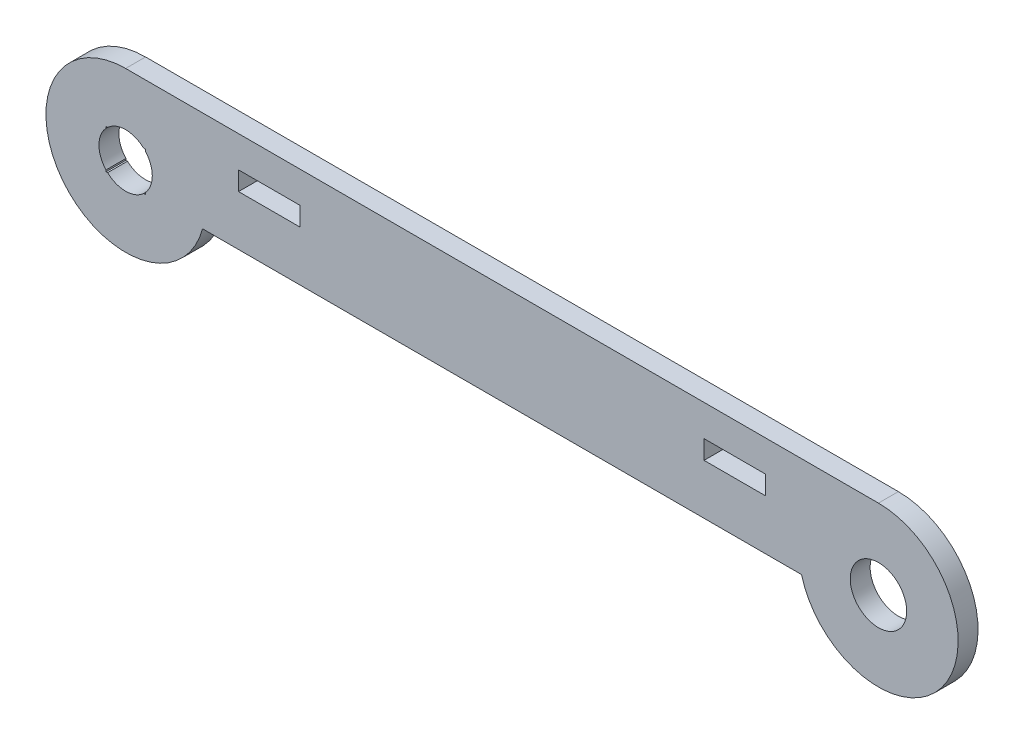
ISO-10303-21;
HEADER;
FILE_DESCRIPTION(('STEP AP214'),'2;1');
FILE_NAME('part.step','',(''),(''),'','','');
FILE_SCHEMA(('AUTOMOTIVE_DESIGN { 1 0 10303 214 1 1 1 1 }'));
ENDSEC;
DATA;
#1=APPLICATION_CONTEXT('core data for automotive mechanical design processes');
#2=APPLICATION_PROTOCOL_DEFINITION('international standard','automotive_design',2000,#1);
#3=PRODUCT_CONTEXT('',#1,'mechanical');
#4=PRODUCT('Part','Part','',(#3));
#5=PRODUCT_RELATED_PRODUCT_CATEGORY('part','',(#4));
#6=PRODUCT_DEFINITION_FORMATION('','',#4);
#7=PRODUCT_DEFINITION_CONTEXT('part definition',#1,'design');
#8=PRODUCT_DEFINITION('design','',#6,#7);
#9=PRODUCT_DEFINITION_SHAPE('','',#8);
#10=(LENGTH_UNIT() NAMED_UNIT(*) SI_UNIT(.MILLI.,.METRE.));
#11=(NAMED_UNIT(*) PLANE_ANGLE_UNIT() SI_UNIT($,.RADIAN.));
#12=(NAMED_UNIT(*) SI_UNIT($,.STERADIAN.) SOLID_ANGLE_UNIT());
#13=UNCERTAINTY_MEASURE_WITH_UNIT(LENGTH_MEASURE(1.E-05),#10,'distance_accuracy_value','');
#14=(GEOMETRIC_REPRESENTATION_CONTEXT(3) GLOBAL_UNCERTAINTY_ASSIGNED_CONTEXT((#13)) GLOBAL_UNIT_ASSIGNED_CONTEXT((#10,
#11,#12)) REPRESENTATION_CONTEXT('',''));
#15=CARTESIAN_POINT('',(0.,0.,0.));
#16=DIRECTION('',(0.,0.,1.));
#17=DIRECTION('',(1.,0.,0.));
#18=AXIS2_PLACEMENT_3D('',#15,#16,#17);
#19=CARTESIAN_POINT('',(1.565,0.,1.5875));
#20=DIRECTION('',(-1.,0.,0.));
#21=DIRECTION('',(0.,0.,1.));
#22=AXIS2_PLACEMENT_3D('',#19,#20,#21);
#23=PLANE('',#22);
#24=DIRECTION('',(0.,0.,1.));
#25=VECTOR('',#24,1.);
#26=CARTESIAN_POINT('',(1.565,-1.43749782608531,0.));
#27=LINE('',#26,#25);
#28=CARTESIAN_POINT('',(1.565,-1.43749782608531,0.));
#29=VERTEX_POINT('',#28);
#30=CARTESIAN_POINT('',(1.565,-1.43749782608531,1.5875));
#31=VERTEX_POINT('',#30);
#32=EDGE_CURVE('E285',#29,#31,#27,.T.);
#33=ORIENTED_EDGE('',*,*,#32,.F.);
#34=DIRECTION('',(0.,1.,0.));
#35=VECTOR('',#34,1.);
#36=CARTESIAN_POINT('',(1.565,0.,0.));
#37=LINE('',#36,#35);
#38=CARTESIAN_POINT('',(1.565,-1.565,0.));
#39=VERTEX_POINT('',#38);
#40=EDGE_CURVE('E321',#39,#29,#37,.T.);
#41=ORIENTED_EDGE('',*,*,#40,.F.);
#42=DIRECTION('',(0.,0.,-1.));
#43=VECTOR('',#42,1.);
#44=CARTESIAN_POINT('',(1.565,-1.565,1.5875));
#45=LINE('',#44,#43);
#46=CARTESIAN_POINT('',(1.565,-1.565,1.5875));
#47=VERTEX_POINT('',#46);
#48=EDGE_CURVE('E239',#47,#39,#45,.T.);
#49=ORIENTED_EDGE('',*,*,#48,.F.);
#50=DIRECTION('',(0.,1.,0.));
#51=VECTOR('',#50,1.);
#52=CARTESIAN_POINT('',(1.565,0.,1.5875));
#53=LINE('',#52,#51);
#54=EDGE_CURVE('E340',#47,#31,#53,.T.);
#55=ORIENTED_EDGE('',*,*,#54,.T.);
#56=EDGE_LOOP('',(#33,#41,#49,#55));
#57=FACE_BOUND('',#56,.T.);
#58=ADVANCED_FACE('F34',(#57),#23,.T.);
#59=CARTESIAN_POINT('',(0.,-1.565,1.5875));
#60=DIRECTION('',(0.,1.,0.));
#61=DIRECTION('',(0.,0.,1.));
#62=AXIS2_PLACEMENT_3D('',#59,#60,#61);
#63=PLANE('',#62);
#64=DIRECTION('',(0.,0.,1.));
#65=VECTOR('',#64,1.);
#66=CARTESIAN_POINT('',(-1.43749782608531,-1.565,0.));
#67=LINE('',#66,#65);
#68=CARTESIAN_POINT('',(-1.43749782608531,-1.565,0.));
#69=VERTEX_POINT('',#68);
#70=CARTESIAN_POINT('',(-1.43749782608531,-1.565,1.5875));
#71=VERTEX_POINT('',#70);
#72=EDGE_CURVE('E413',#69,#71,#67,.T.);
#73=ORIENTED_EDGE('',*,*,#72,.F.);
#74=DIRECTION('',(1.,0.,0.));
#75=VECTOR('',#74,1.);
#76=CARTESIAN_POINT('',(0.,-1.565,0.));
#77=LINE('',#76,#75);
#78=CARTESIAN_POINT('',(-1.565,-1.565,0.));
#79=VERTEX_POINT('',#78);
#80=EDGE_CURVE('E324',#79,#69,#77,.T.);
#81=ORIENTED_EDGE('',*,*,#80,.F.);
#82=DIRECTION('',(0.,0.,-1.));
#83=VECTOR('',#82,1.);
#84=CARTESIAN_POINT('',(-1.565,-1.565,1.5875));
#85=LINE('',#84,#83);
#86=CARTESIAN_POINT('',(-1.565,-1.565,1.5875));
#87=VERTEX_POINT('',#86);
#88=EDGE_CURVE('E237',#87,#79,#85,.T.);
#89=ORIENTED_EDGE('',*,*,#88,.F.);
#90=DIRECTION('',(1.,0.,0.));
#91=VECTOR('',#90,1.);
#92=CARTESIAN_POINT('',(0.,-1.565,1.5875));
#93=LINE('',#92,#91);
#94=EDGE_CURVE('E369',#87,#71,#93,.T.);
#95=ORIENTED_EDGE('',*,*,#94,.T.);
#96=EDGE_LOOP('',(#73,#81,#89,#95));
#97=FACE_BOUND('',#96,.T.);
#98=ADVANCED_FACE('F394',(#97),#63,.T.);
#99=CARTESIAN_POINT('',(-1.565,0.,1.5875));
#100=DIRECTION('',(-1.,0.,0.));
#101=DIRECTION('',(0.,0.,1.));
#102=AXIS2_PLACEMENT_3D('',#99,#100,#101);
#103=PLANE('',#102);
#104=DIRECTION('',(0.,1.,0.));
#105=VECTOR('',#104,1.);
#106=CARTESIAN_POINT('',(-1.565,0.,0.));
#107=LINE('',#106,#105);
#108=CARTESIAN_POINT('',(-1.565,-1.43749782608531,0.));
#109=VERTEX_POINT('',#108);
#110=EDGE_CURVE('E220',#79,#109,#107,.T.);
#111=ORIENTED_EDGE('',*,*,#110,.T.);
#112=DIRECTION('',(0.,0.,1.));
#113=VECTOR('',#112,1.);
#114=CARTESIAN_POINT('',(-1.565,-1.43749782608531,0.));
#115=LINE('',#114,#113);
#116=CARTESIAN_POINT('',(-1.565,-1.43749782608531,1.5875));
#117=VERTEX_POINT('',#116);
#118=EDGE_CURVE('E58',#109,#117,#115,.T.);
#119=ORIENTED_EDGE('',*,*,#118,.T.);
#120=DIRECTION('',(0.,1.,0.));
#121=VECTOR('',#120,1.);
#122=CARTESIAN_POINT('',(-1.565,0.,1.5875));
#123=LINE('',#122,#121);
#124=EDGE_CURVE('E364',#87,#117,#123,.T.);
#125=ORIENTED_EDGE('',*,*,#124,.F.);
#126=ORIENTED_EDGE('',*,*,#88,.T.);
#127=EDGE_LOOP('',(#111,#119,#125,#126));
#128=FACE_BOUND('',#127,.T.);
#129=ADVANCED_FACE('F363',(#128),#103,.F.);
#130=CARTESIAN_POINT('',(0.,1.565,1.5875));
#131=DIRECTION('',(0.,1.,0.));
#132=DIRECTION('',(0.,0.,1.));
#133=AXIS2_PLACEMENT_3D('',#130,#131,#132);
#134=PLANE('',#133);
#135=DIRECTION('',(1.,0.,0.));
#136=VECTOR('',#135,1.);
#137=CARTESIAN_POINT('',(0.,1.565,0.));
#138=LINE('',#137,#136);
#139=CARTESIAN_POINT('',(-1.565,1.565,0.));
#140=VERTEX_POINT('',#139);
#141=CARTESIAN_POINT('',(-1.43749782608531,1.565,0.));
#142=VERTEX_POINT('',#141);
#143=EDGE_CURVE('E219',#140,#142,#138,.T.);
#144=ORIENTED_EDGE('',*,*,#143,.T.);
#145=DIRECTION('',(0.,0.,1.));
#146=VECTOR('',#145,1.);
#147=CARTESIAN_POINT('',(-1.43749782608531,1.565,0.));
#148=LINE('',#147,#146);
#149=CARTESIAN_POINT('',(-1.43749782608531,1.565,1.5875));
#150=VERTEX_POINT('',#149);
#151=EDGE_CURVE('E199',#142,#150,#148,.T.);
#152=ORIENTED_EDGE('',*,*,#151,.T.);
#153=DIRECTION('',(1.,0.,0.));
#154=VECTOR('',#153,1.);
#155=CARTESIAN_POINT('',(0.,1.565,1.5875));
#156=LINE('',#155,#154);
#157=CARTESIAN_POINT('',(-1.565,1.565,1.5875));
#158=VERTEX_POINT('',#157);
#159=EDGE_CURVE('E372',#158,#150,#156,.T.);
#160=ORIENTED_EDGE('',*,*,#159,.F.);
#161=DIRECTION('',(0.,0.,-1.));
#162=VECTOR('',#161,1.);
#163=CARTESIAN_POINT('',(-1.565,1.565,1.5875));
#164=LINE('',#163,#162);
#165=EDGE_CURVE('E233',#158,#140,#164,.T.);
#166=ORIENTED_EDGE('',*,*,#165,.T.);
#167=EDGE_LOOP('',(#144,#152,#160,#166));
#168=FACE_BOUND('',#167,.T.);
#169=ADVANCED_FACE('F404',(#168),#134,.F.);
#170=DIRECTION('',(0.,0.,1.));
#171=VECTOR('',#170,1.);
#172=CARTESIAN_POINT('',(1.565,1.43749782608531,0.));
#173=LINE('',#172,#171);
#174=CARTESIAN_POINT('',(1.565,1.43749782608531,1.5875));
#175=VERTEX_POINT('',#174);
#176=CARTESIAN_POINT('',(1.565,1.43749782608531,0.));
#177=VERTEX_POINT('',#176);
#178=EDGE_CURVE('E289',#175,#177,#173,.F.);
#179=ORIENTED_EDGE('',*,*,#178,.F.);
#180=CARTESIAN_POINT('',(1.565,1.565,1.5875));
#181=VERTEX_POINT('',#180);
#182=EDGE_CURVE('E351',#175,#181,#53,.T.);
#183=ORIENTED_EDGE('',*,*,#182,.T.);
#184=DIRECTION('',(0.,0.,-1.));
#185=VECTOR('',#184,1.);
#186=CARTESIAN_POINT('',(1.565,1.565,1.5875));
#187=LINE('',#186,#185);
#188=CARTESIAN_POINT('',(1.565,1.565,0.));
#189=VERTEX_POINT('',#188);
#190=EDGE_CURVE('E231',#181,#189,#187,.T.);
#191=ORIENTED_EDGE('',*,*,#190,.T.);
#192=EDGE_CURVE('E217',#177,#189,#37,.T.);
#193=ORIENTED_EDGE('',*,*,#192,.F.);
#194=EDGE_LOOP('',(#179,#183,#191,#193));
#195=FACE_BOUND('',#194,.T.);
#196=ADVANCED_FACE('F396',(#195),#23,.T.);
#197=DIRECTION('',(0.,0.,1.));
#198=VECTOR('',#197,1.);
#199=CARTESIAN_POINT('',(1.43749782608531,-1.565,0.));
#200=LINE('',#199,#198);
#201=CARTESIAN_POINT('',(1.43749782608531,-1.565,1.5875));
#202=VERTEX_POINT('',#201);
#203=CARTESIAN_POINT('',(1.43749782608531,-1.565,0.));
#204=VERTEX_POINT('',#203);
#205=EDGE_CURVE('E50',#202,#204,#200,.F.);
#206=ORIENTED_EDGE('',*,*,#205,.F.);
#207=EDGE_CURVE('E335',#202,#47,#93,.T.);
#208=ORIENTED_EDGE('',*,*,#207,.T.);
#209=ORIENTED_EDGE('',*,*,#48,.T.);
#210=EDGE_CURVE('E323',#204,#39,#77,.T.);
#211=ORIENTED_EDGE('',*,*,#210,.F.);
#212=EDGE_LOOP('',(#206,#208,#209,#211));
#213=FACE_BOUND('',#212,.T.);
#214=ADVANCED_FACE('F333',(#213),#63,.T.);
#215=CARTESIAN_POINT('',(-1.565,1.43749782608531,1.5875));
#216=VERTEX_POINT('',#215);
#217=EDGE_CURVE('E370',#216,#158,#123,.T.);
#218=ORIENTED_EDGE('',*,*,#217,.F.);
#219=DIRECTION('',(0.,0.,1.));
#220=VECTOR('',#219,1.);
#221=CARTESIAN_POINT('',(-1.565,1.43749782608531,0.));
#222=LINE('',#221,#220);
#223=CARTESIAN_POINT('',(-1.565,1.43749782608531,0.));
#224=VERTEX_POINT('',#223);
#225=EDGE_CURVE('E358',#216,#224,#222,.F.);
#226=ORIENTED_EDGE('',*,*,#225,.T.);
#227=EDGE_CURVE('E224',#224,#140,#107,.T.);
#228=ORIENTED_EDGE('',*,*,#227,.T.);
#229=ORIENTED_EDGE('',*,*,#165,.F.);
#230=EDGE_LOOP('',(#218,#226,#228,#229));
#231=FACE_BOUND('',#230,.T.);
#232=ADVANCED_FACE('F410',(#231),#103,.F.);
#233=CARTESIAN_POINT('',(0.,3.84999999999999,1.5875));
#234=DIRECTION('',(0.,-1.,0.));
#235=DIRECTION('',(1.,0.,0.));
#236=AXIS2_PLACEMENT_3D('',#233,#234,#235);
#237=PLANE('',#236);
#238=DIRECTION('',(-1.,0.,0.));
#239=VECTOR('',#238,1.);
#240=CARTESIAN_POINT('',(0.,3.84999999999999,0.));
#241=LINE('',#240,#239);
#242=CARTESIAN_POINT('',(51.,3.85,0.));
#243=VERTEX_POINT('',#242);
#244=CARTESIAN_POINT('',(46.1,3.85,0.));
#245=VERTEX_POINT('',#244);
#246=EDGE_CURVE('E309',#243,#245,#241,.T.);
#247=ORIENTED_EDGE('',*,*,#246,.F.);
#248=DIRECTION('',(0.,0.,-1.));
#249=VECTOR('',#248,1.);
#250=CARTESIAN_POINT('',(51.,3.85,1.5875));
#251=LINE('',#250,#249);
#252=CARTESIAN_POINT('',(51.,3.85,1.5875));
#253=VERTEX_POINT('',#252);
#254=EDGE_CURVE('E234',#253,#243,#251,.T.);
#255=ORIENTED_EDGE('',*,*,#254,.F.);
#256=DIRECTION('',(-1.,0.,0.));
#257=VECTOR('',#256,1.);
#258=CARTESIAN_POINT('',(0.,3.84999999999999,1.5875));
#259=LINE('',#258,#257);
#260=CARTESIAN_POINT('',(46.1,3.85,1.5875));
#261=VERTEX_POINT('',#260);
#262=EDGE_CURVE('E436',#253,#261,#259,.T.);
#263=ORIENTED_EDGE('',*,*,#262,.T.);
#264=DIRECTION('',(0.,0.,-1.));
#265=VECTOR('',#264,1.);
#266=CARTESIAN_POINT('',(46.1,3.85,1.5875));
#267=LINE('',#266,#265);
#268=EDGE_CURVE('E242',#261,#245,#267,.T.);
#269=ORIENTED_EDGE('',*,*,#268,.T.);
#270=EDGE_LOOP('',(#247,#255,#263,#269));
#271=FACE_BOUND('',#270,.T.);
#272=ADVANCED_FACE('F453',(#271),#237,.T.);
#273=CARTESIAN_POINT('',(51.,0.,1.5875));
#274=DIRECTION('',(-1.,0.,0.));
#275=DIRECTION('',(0.,0.,1.));
#276=AXIS2_PLACEMENT_3D('',#273,#274,#275);
#277=PLANE('',#276);
#278=DIRECTION('',(0.,1.,0.));
#279=VECTOR('',#278,1.);
#280=CARTESIAN_POINT('',(51.,0.,0.));
#281=LINE('',#280,#279);
#282=CARTESIAN_POINT('',(51.,2.35,0.));
#283=VERTEX_POINT('',#282);
#284=EDGE_CURVE('E312',#283,#243,#281,.T.);
#285=ORIENTED_EDGE('',*,*,#284,.F.);
#286=DIRECTION('',(0.,0.,-1.));
#287=VECTOR('',#286,1.);
#288=CARTESIAN_POINT('',(51.,2.35,1.5875));
#289=LINE('',#288,#287);
#290=CARTESIAN_POINT('',(51.,2.35,1.5875));
#291=VERTEX_POINT('',#290);
#292=EDGE_CURVE('E248',#291,#283,#289,.T.);
#293=ORIENTED_EDGE('',*,*,#292,.F.);
#294=DIRECTION('',(0.,1.,0.));
#295=VECTOR('',#294,1.);
#296=CARTESIAN_POINT('',(51.,0.,1.5875));
#297=LINE('',#296,#295);
#298=EDGE_CURVE('E439',#291,#253,#297,.T.);
#299=ORIENTED_EDGE('',*,*,#298,.T.);
#300=ORIENTED_EDGE('',*,*,#254,.T.);
#301=EDGE_LOOP('',(#285,#293,#299,#300));
#302=FACE_BOUND('',#301,.T.);
#303=ADVANCED_FACE('F458',(#302),#277,.T.);
#304=CARTESIAN_POINT('',(0.,2.34999999999999,1.5875));
#305=DIRECTION('',(0.,-1.,0.));
#306=DIRECTION('',(1.,0.,0.));
#307=AXIS2_PLACEMENT_3D('',#304,#305,#306);
#308=PLANE('',#307);
#309=DIRECTION('',(-1.,0.,0.));
#310=VECTOR('',#309,1.);
#311=CARTESIAN_POINT('',(0.,2.34999999999999,0.));
#312=LINE('',#311,#310);
#313=CARTESIAN_POINT('',(46.1,2.35,0.));
#314=VERTEX_POINT('',#313);
#315=EDGE_CURVE('E315',#283,#314,#312,.T.);
#316=ORIENTED_EDGE('',*,*,#315,.T.);
#317=DIRECTION('',(0.,0.,-1.));
#318=VECTOR('',#317,1.);
#319=CARTESIAN_POINT('',(46.1,2.35,1.5875));
#320=LINE('',#319,#318);
#321=CARTESIAN_POINT('',(46.1,2.35,1.5875));
#322=VERTEX_POINT('',#321);
#323=EDGE_CURVE('E244',#322,#314,#320,.T.);
#324=ORIENTED_EDGE('',*,*,#323,.F.);
#325=DIRECTION('',(-1.,0.,0.));
#326=VECTOR('',#325,1.);
#327=CARTESIAN_POINT('',(0.,2.34999999999999,1.5875));
#328=LINE('',#327,#326);
#329=EDGE_CURVE('E442',#291,#322,#328,.T.);
#330=ORIENTED_EDGE('',*,*,#329,.F.);
#331=ORIENTED_EDGE('',*,*,#292,.T.);
#332=EDGE_LOOP('',(#316,#324,#330,#331));
#333=FACE_BOUND('',#332,.T.);
#334=ADVANCED_FACE('F581',(#333),#308,.F.);
#335=CARTESIAN_POINT('',(13.9,0.,1.5875));
#336=DIRECTION('',(-1.,0.,0.));
#337=DIRECTION('',(0.,0.,1.));
#338=AXIS2_PLACEMENT_3D('',#335,#336,#337);
#339=PLANE('',#338);
#340=DIRECTION('',(0.,1.,0.));
#341=VECTOR('',#340,1.);
#342=CARTESIAN_POINT('',(13.9,0.,0.));
#343=LINE('',#342,#341);
#344=CARTESIAN_POINT('',(13.9,2.35,0.));
#345=VERTEX_POINT('',#344);
#346=CARTESIAN_POINT('',(13.9,3.85,0.));
#347=VERTEX_POINT('',#346);
#348=EDGE_CURVE('E297',#345,#347,#343,.T.);
#349=ORIENTED_EDGE('',*,*,#348,.F.);
#350=DIRECTION('',(0.,0.,-1.));
#351=VECTOR('',#350,1.);
#352=CARTESIAN_POINT('',(13.9,2.35,1.5875));
#353=LINE('',#352,#351);
#354=CARTESIAN_POINT('',(13.9,2.35,1.5875));
#355=VERTEX_POINT('',#354);
#356=EDGE_CURVE('E245',#355,#345,#353,.T.);
#357=ORIENTED_EDGE('',*,*,#356,.F.);
#358=DIRECTION('',(0.,1.,0.));
#359=VECTOR('',#358,1.);
#360=CARTESIAN_POINT('',(13.9,0.,1.5875));
#361=LINE('',#360,#359);
#362=CARTESIAN_POINT('',(13.9,3.85,1.5875));
#363=VERTEX_POINT('',#362);
#364=EDGE_CURVE('E425',#355,#363,#361,.T.);
#365=ORIENTED_EDGE('',*,*,#364,.T.);
#366=DIRECTION('',(0.,0.,-1.));
#367=VECTOR('',#366,1.);
#368=CARTESIAN_POINT('',(13.9,3.85,1.5875));
#369=LINE('',#368,#367);
#370=EDGE_CURVE('E251',#363,#347,#369,.T.);
#371=ORIENTED_EDGE('',*,*,#370,.T.);
#372=EDGE_LOOP('',(#349,#357,#365,#371));
#373=FACE_BOUND('',#372,.T.);
#374=ADVANCED_FACE('F575',(#373),#339,.T.);
#375=CARTESIAN_POINT('',(0.,2.35,1.5875));
#376=DIRECTION('',(0.,1.,0.));
#377=DIRECTION('',(0.,0.,1.));
#378=AXIS2_PLACEMENT_3D('',#375,#376,#377);
#379=PLANE('',#378);
#380=DIRECTION('',(1.,0.,0.));
#381=VECTOR('',#380,1.);
#382=CARTESIAN_POINT('',(0.,2.35,0.));
#383=LINE('',#382,#381);
#384=CARTESIAN_POINT('',(9.,2.35,0.));
#385=VERTEX_POINT('',#384);
#386=EDGE_CURVE('E300',#385,#345,#383,.T.);
#387=ORIENTED_EDGE('',*,*,#386,.F.);
#388=DIRECTION('',(0.,0.,-1.));
#389=VECTOR('',#388,1.);
#390=CARTESIAN_POINT('',(9.,2.35,1.5875));
#391=LINE('',#390,#389);
#392=CARTESIAN_POINT('',(9.,2.35,1.5875));
#393=VERTEX_POINT('',#392);
#394=EDGE_CURVE('E257',#393,#385,#391,.T.);
#395=ORIENTED_EDGE('',*,*,#394,.F.);
#396=DIRECTION('',(1.,0.,0.));
#397=VECTOR('',#396,1.);
#398=CARTESIAN_POINT('',(0.,2.35,1.5875));
#399=LINE('',#398,#397);
#400=EDGE_CURVE('E428',#393,#355,#399,.T.);
#401=ORIENTED_EDGE('',*,*,#400,.T.);
#402=ORIENTED_EDGE('',*,*,#356,.T.);
#403=EDGE_LOOP('',(#387,#395,#401,#402));
#404=FACE_BOUND('',#403,.T.);
#405=ADVANCED_FACE('F580',(#404),#379,.T.);
#406=CARTESIAN_POINT('',(9.,0.,1.5875));
#407=DIRECTION('',(-1.,0.,0.));
#408=DIRECTION('',(0.,0.,1.));
#409=AXIS2_PLACEMENT_3D('',#406,#407,#408);
#410=PLANE('',#409);
#411=DIRECTION('',(0.,1.,0.));
#412=VECTOR('',#411,1.);
#413=CARTESIAN_POINT('',(9.,0.,0.));
#414=LINE('',#413,#412);
#415=CARTESIAN_POINT('',(9.,3.85,0.));
#416=VERTEX_POINT('',#415);
#417=EDGE_CURVE('E303',#385,#416,#414,.T.);
#418=ORIENTED_EDGE('',*,*,#417,.T.);
#419=DIRECTION('',(0.,0.,-1.));
#420=VECTOR('',#419,1.);
#421=CARTESIAN_POINT('',(9.,3.85,1.5875));
#422=LINE('',#421,#420);
#423=CARTESIAN_POINT('',(9.,3.85,1.5875));
#424=VERTEX_POINT('',#423);
#425=EDGE_CURVE('E253',#424,#416,#422,.T.);
#426=ORIENTED_EDGE('',*,*,#425,.F.);
#427=DIRECTION('',(0.,1.,0.));
#428=VECTOR('',#427,1.);
#429=CARTESIAN_POINT('',(9.,0.,1.5875));
#430=LINE('',#429,#428);
#431=EDGE_CURVE('E431',#393,#424,#430,.T.);
#432=ORIENTED_EDGE('',*,*,#431,.F.);
#433=ORIENTED_EDGE('',*,*,#394,.T.);
#434=EDGE_LOOP('',(#418,#426,#432,#433));
#435=FACE_BOUND('',#434,.T.);
#436=ADVANCED_FACE('F559',(#435),#410,.F.);
#437=CARTESIAN_POINT('',(0.,-1.65,1.5875));
#438=DIRECTION('',(0.,1.,0.));
#439=DIRECTION('',(0.,0.,1.));
#440=AXIS2_PLACEMENT_3D('',#437,#438,#439);
#441=PLANE('',#440);
#442=DIRECTION('',(1.,0.,0.));
#443=VECTOR('',#442,1.);
#444=CARTESIAN_POINT('',(0.,-1.65,0.));
#445=LINE('',#444,#443);
#446=CARTESIAN_POINT('',(6.13188388670236,-1.65,0.));
#447=VERTEX_POINT('',#446);
#448=CARTESIAN_POINT('',(53.8681161132976,-1.65,0.));
#449=VERTEX_POINT('',#448);
#450=EDGE_CURVE('E281',#447,#449,#445,.T.);
#451=ORIENTED_EDGE('',*,*,#450,.T.);
#452=DIRECTION('',(0.,0.,-1.));
#453=VECTOR('',#452,1.);
#454=CARTESIAN_POINT('',(53.8681161132976,-1.65,1.5875));
#455=LINE('',#454,#453);
#456=CARTESIAN_POINT('',(53.8681161132976,-1.65,1.5875));
#457=VERTEX_POINT('',#456);
#458=EDGE_CURVE('E254',#457,#449,#455,.T.);
#459=ORIENTED_EDGE('',*,*,#458,.F.);
#460=DIRECTION('',(1.,0.,0.));
#461=VECTOR('',#460,1.);
#462=CARTESIAN_POINT('',(0.,-1.65,1.5875));
#463=LINE('',#462,#461);
#464=CARTESIAN_POINT('',(6.13188388670236,-1.65,1.5875));
#465=VERTEX_POINT('',#464);
#466=EDGE_CURVE('E230',#465,#457,#463,.T.);
#467=ORIENTED_EDGE('',*,*,#466,.F.);
#468=DIRECTION('',(0.,0.,-1.));
#469=VECTOR('',#468,1.);
#470=CARTESIAN_POINT('',(6.13188388670236,-1.65,1.5875));
#471=LINE('',#470,#469);
#472=EDGE_CURVE('E260',#465,#447,#471,.T.);
#473=ORIENTED_EDGE('',*,*,#472,.T.);
#474=EDGE_LOOP('',(#451,#459,#467,#473));
#475=FACE_BOUND('',#474,.T.);
#476=ADVANCED_FACE('F36',(#475),#441,.F.);
#477=CARTESIAN_POINT('',(60.,0.,1.5875));
#478=DIRECTION('',(0.,0.,-1.));
#479=DIRECTION('',(-1.,0.,0.));
#480=AXIS2_PLACEMENT_3D('',#477,#478,#479);
#481=CYLINDRICAL_SURFACE('',#480,6.35);
#482=CARTESIAN_POINT('',(60.,0.,0.));
#483=DIRECTION('',(0.,0.,1.));
#484=DIRECTION('',(1.,0.,0.));
#485=AXIS2_PLACEMENT_3D('',#482,#483,#484);
#486=CIRCLE('',#485,6.35);
#487=CARTESIAN_POINT('',(60.,6.35,0.));
#488=VERTEX_POINT('',#487);
#489=EDGE_CURVE('E274',#449,#488,#486,.T.);
#490=ORIENTED_EDGE('',*,*,#489,.T.);
#491=DIRECTION('',(0.,0.,-1.));
#492=VECTOR('',#491,1.);
#493=CARTESIAN_POINT('',(60.,6.35,1.5875));
#494=LINE('',#493,#492);
#495=CARTESIAN_POINT('',(60.,6.35,1.5875));
#496=VERTEX_POINT('',#495);
#497=EDGE_CURVE('E266',#496,#488,#494,.T.);
#498=ORIENTED_EDGE('',*,*,#497,.F.);
#499=CARTESIAN_POINT('',(60.,0.,1.5875));
#500=DIRECTION('',(0.,0.,1.));
#501=DIRECTION('',(1.,0.,0.));
#502=AXIS2_PLACEMENT_3D('',#499,#500,#501);
#503=CIRCLE('',#502,6.35);
#504=EDGE_CURVE('E276',#457,#496,#503,.T.);
#505=ORIENTED_EDGE('',*,*,#504,.F.);
#506=ORIENTED_EDGE('',*,*,#458,.T.);
#507=EDGE_LOOP('',(#490,#498,#505,#506));
#508=FACE_BOUND('',#507,.T.);
#509=ADVANCED_FACE('F272',(#508),#481,.T.);
#510=CARTESIAN_POINT('',(0.,6.35,1.5875));
#511=DIRECTION('',(0.,1.,0.));
#512=DIRECTION('',(0.,0.,1.));
#513=AXIS2_PLACEMENT_3D('',#510,#511,#512);
#514=PLANE('',#513);
#515=DIRECTION('',(1.,0.,0.));
#516=VECTOR('',#515,1.);
#517=CARTESIAN_POINT('',(0.,6.35,0.));
#518=LINE('',#517,#516);
#519=CARTESIAN_POINT('',(0.,6.35,0.));
#520=VERTEX_POINT('',#519);
#521=EDGE_CURVE('E287',#520,#488,#518,.T.);
#522=ORIENTED_EDGE('',*,*,#521,.F.);
#523=DIRECTION('',(0.,0.,-1.));
#524=VECTOR('',#523,1.);
#525=CARTESIAN_POINT('',(0.,6.35,1.5875));
#526=LINE('',#525,#524);
#527=CARTESIAN_POINT('',(0.,6.35,1.5875));
#528=VERTEX_POINT('',#527);
#529=EDGE_CURVE('E263',#528,#520,#526,.T.);
#530=ORIENTED_EDGE('',*,*,#529,.F.);
#531=DIRECTION('',(1.,0.,0.));
#532=VECTOR('',#531,1.);
#533=CARTESIAN_POINT('',(0.,6.35,1.5875));
#534=LINE('',#533,#532);
#535=EDGE_CURVE('E420',#528,#496,#534,.T.);
#536=ORIENTED_EDGE('',*,*,#535,.T.);
#537=ORIENTED_EDGE('',*,*,#497,.T.);
#538=EDGE_LOOP('',(#522,#530,#536,#537));
#539=FACE_BOUND('',#538,.T.);
#540=ADVANCED_FACE('F495',(#539),#514,.T.);
#541=CARTESIAN_POINT('',(1.43749782608531,1.565,1.5875));
#542=VERTEX_POINT('',#541);
#543=EDGE_CURVE('E210',#542,#181,#156,.T.);
#544=ORIENTED_EDGE('',*,*,#543,.F.);
#545=DIRECTION('',(0.,0.,1.));
#546=VECTOR('',#545,1.);
#547=CARTESIAN_POINT('',(1.43749782608531,1.565,0.));
#548=LINE('',#547,#546);
#549=CARTESIAN_POINT('',(1.43749782608531,1.565,0.));
#550=VERTEX_POINT('',#549);
#551=EDGE_CURVE('E196',#542,#550,#548,.F.);
#552=ORIENTED_EDGE('',*,*,#551,.T.);
#553=EDGE_CURVE('E208',#550,#189,#138,.T.);
#554=ORIENTED_EDGE('',*,*,#553,.T.);
#555=ORIENTED_EDGE('',*,*,#190,.F.);
#556=EDGE_LOOP('',(#544,#552,#554,#555));
#557=FACE_BOUND('',#556,.T.);
#558=ADVANCED_FACE('F206',(#557),#134,.F.);
#559=CARTESIAN_POINT('',(46.1,0.,1.5875));
#560=DIRECTION('',(-1.,0.,0.));
#561=DIRECTION('',(0.,0.,1.));
#562=AXIS2_PLACEMENT_3D('',#559,#560,#561);
#563=PLANE('',#562);
#564=DIRECTION('',(0.,1.,0.));
#565=VECTOR('',#564,1.);
#566=CARTESIAN_POINT('',(46.1,0.,0.));
#567=LINE('',#566,#565);
#568=EDGE_CURVE('E318',#314,#245,#567,.T.);
#569=ORIENTED_EDGE('',*,*,#568,.T.);
#570=ORIENTED_EDGE('',*,*,#268,.F.);
#571=DIRECTION('',(0.,1.,0.));
#572=VECTOR('',#571,1.);
#573=CARTESIAN_POINT('',(46.1,0.,1.5875));
#574=LINE('',#573,#572);
#575=EDGE_CURVE('E445',#322,#261,#574,.T.);
#576=ORIENTED_EDGE('',*,*,#575,.F.);
#577=ORIENTED_EDGE('',*,*,#323,.T.);
#578=EDGE_LOOP('',(#569,#570,#576,#577));
#579=FACE_BOUND('',#578,.T.);
#580=ADVANCED_FACE('F494',(#579),#563,.F.);
#581=CARTESIAN_POINT('',(0.,3.85,1.5875));
#582=DIRECTION('',(0.,1.,0.));
#583=DIRECTION('',(0.,0.,1.));
#584=AXIS2_PLACEMENT_3D('',#581,#582,#583);
#585=PLANE('',#584);
#586=DIRECTION('',(1.,0.,0.));
#587=VECTOR('',#586,1.);
#588=CARTESIAN_POINT('',(0.,3.85,0.));
#589=LINE('',#588,#587);
#590=EDGE_CURVE('E306',#416,#347,#589,.T.);
#591=ORIENTED_EDGE('',*,*,#590,.T.);
#592=ORIENTED_EDGE('',*,*,#370,.F.);
#593=DIRECTION('',(1.,0.,0.));
#594=VECTOR('',#593,1.);
#595=CARTESIAN_POINT('',(0.,3.85,1.5875));
#596=LINE('',#595,#594);
#597=EDGE_CURVE('E434',#424,#363,#596,.T.);
#598=ORIENTED_EDGE('',*,*,#597,.F.);
#599=ORIENTED_EDGE('',*,*,#425,.T.);
#600=EDGE_LOOP('',(#591,#592,#598,#599));
#601=FACE_BOUND('',#600,.T.);
#602=ADVANCED_FACE('F602',(#601),#585,.F.);
#603=CARTESIAN_POINT('',(0.,0.,1.5875));
#604=DIRECTION('',(0.,0.,-1.));
#605=DIRECTION('',(-1.,0.,0.));
#606=AXIS2_PLACEMENT_3D('',#603,#604,#605);
#607=CYLINDRICAL_SURFACE('',#606,6.35);
#608=CARTESIAN_POINT('',(0.,0.,0.));
#609=DIRECTION('',(0.,0.,1.));
#610=DIRECTION('',(1.,0.,0.));
#611=AXIS2_PLACEMENT_3D('',#608,#609,#610);
#612=CIRCLE('',#611,6.35);
#613=EDGE_CURVE('E295',#520,#447,#612,.T.);
#614=ORIENTED_EDGE('',*,*,#613,.T.);
#615=ORIENTED_EDGE('',*,*,#472,.F.);
#616=CARTESIAN_POINT('',(0.,0.,1.5875));
#617=DIRECTION('',(0.,0.,1.));
#618=DIRECTION('',(1.,0.,0.));
#619=AXIS2_PLACEMENT_3D('',#616,#617,#618);
#620=CIRCLE('',#619,6.35);
#621=EDGE_CURVE('E423',#528,#465,#620,.T.);
#622=ORIENTED_EDGE('',*,*,#621,.F.);
#623=ORIENTED_EDGE('',*,*,#529,.T.);
#624=EDGE_LOOP('',(#614,#615,#622,#623));
#625=FACE_BOUND('',#624,.T.);
#626=ADVANCED_FACE('F390',(#625),#607,.T.);
#627=CARTESIAN_POINT('',(60.,0.,1.5875));
#628=DIRECTION('',(0.,0.,-1.));
#629=DIRECTION('',(-1.,0.,0.));
#630=AXIS2_PLACEMENT_3D('',#627,#628,#629);
#631=CYLINDRICAL_SURFACE('',#630,2.25);
#632=CARTESIAN_POINT('',(60.,0.,1.5875));
#633=DIRECTION('',(0.,0.,1.));
#634=DIRECTION('',(1.,0.,0.));
#635=AXIS2_PLACEMENT_3D('',#632,#633,#634);
#636=CIRCLE('',#635,2.25);
#637=CARTESIAN_POINT('',(62.25,0.,1.5875));
#638=VERTEX_POINT('',#637);
#639=EDGE_CURVE('E264',#638,#638,#636,.T.);
#640=ORIENTED_EDGE('',*,*,#639,.T.);
#641=EDGE_LOOP('',(#640));
#642=FACE_BOUND('',#641,.T.);
#643=CARTESIAN_POINT('',(60.,0.,0.));
#644=DIRECTION('',(0.,0.,1.));
#645=DIRECTION('',(1.,0.,0.));
#646=AXIS2_PLACEMENT_3D('',#643,#644,#645);
#647=CIRCLE('',#646,2.25);
#648=CARTESIAN_POINT('',(62.25,0.,0.));
#649=VERTEX_POINT('',#648);
#650=EDGE_CURVE('E222',#649,#649,#647,.T.);
#651=ORIENTED_EDGE('',*,*,#650,.F.);
#652=EDGE_LOOP('',(#651));
#653=FACE_BOUND('',#652,.T.);
#654=ADVANCED_FACE('F380',(#642,#653),#631,.F.);
#655=CARTESIAN_POINT('',(0.,0.,1.5875));
#656=DIRECTION('',(0.,0.,1.));
#657=DIRECTION('',(1.,0.,0.));
#658=AXIS2_PLACEMENT_3D('',#655,#656,#657);
#659=PLANE('',#658);
#660=CARTESIAN_POINT('',(0.,0.,1.5875));
#661=DIRECTION('',(0.,0.,1.));
#662=DIRECTION('',(1.,0.,0.));
#663=AXIS2_PLACEMENT_3D('',#660,#661,#662);
#664=CIRCLE('',#663,2.125);
#665=EDGE_CURVE('E211',#542,#150,#664,.T.);
#666=ORIENTED_EDGE('',*,*,#665,.F.);
#667=ORIENTED_EDGE('',*,*,#543,.T.);
#668=ORIENTED_EDGE('',*,*,#182,.F.);
#669=EDGE_CURVE('E344',#31,#175,#664,.T.);
#670=ORIENTED_EDGE('',*,*,#669,.F.);
#671=ORIENTED_EDGE('',*,*,#54,.F.);
#672=ORIENTED_EDGE('',*,*,#207,.F.);
#673=EDGE_CURVE('E352',#71,#202,#664,.T.);
#674=ORIENTED_EDGE('',*,*,#673,.F.);
#675=ORIENTED_EDGE('',*,*,#94,.F.);
#676=ORIENTED_EDGE('',*,*,#124,.T.);
#677=EDGE_CURVE('E354',#216,#117,#664,.T.);
#678=ORIENTED_EDGE('',*,*,#677,.F.);
#679=ORIENTED_EDGE('',*,*,#217,.T.);
#680=ORIENTED_EDGE('',*,*,#159,.T.);
#681=EDGE_LOOP('',(#666,#667,#668,#670,#671,#672,#674,#675,#676,#678,#679,#680));
#682=FACE_BOUND('',#681,.T.);
#683=ORIENTED_EDGE('',*,*,#466,.T.);
#684=ORIENTED_EDGE('',*,*,#504,.T.);
#685=ORIENTED_EDGE('',*,*,#535,.F.);
#686=ORIENTED_EDGE('',*,*,#621,.T.);
#687=EDGE_LOOP('',(#683,#684,#685,#686));
#688=FACE_BOUND('',#687,.T.);
#689=ORIENTED_EDGE('',*,*,#364,.F.);
#690=ORIENTED_EDGE('',*,*,#400,.F.);
#691=ORIENTED_EDGE('',*,*,#431,.T.);
#692=ORIENTED_EDGE('',*,*,#597,.T.);
#693=EDGE_LOOP('',(#689,#690,#691,#692));
#694=FACE_BOUND('',#693,.T.);
#695=ORIENTED_EDGE('',*,*,#262,.F.);
#696=ORIENTED_EDGE('',*,*,#298,.F.);
#697=ORIENTED_EDGE('',*,*,#329,.T.);
#698=ORIENTED_EDGE('',*,*,#575,.T.);
#699=EDGE_LOOP('',(#695,#696,#697,#698));
#700=FACE_BOUND('',#699,.T.);
#701=ORIENTED_EDGE('',*,*,#639,.F.);
#702=EDGE_LOOP('',(#701));
#703=FACE_BOUND('',#702,.T.);
#704=ADVANCED_FACE('F348',(#682,#688,#694,#700,#703),#659,.T.);
#705=CARTESIAN_POINT('',(0.,0.,0.));
#706=DIRECTION('',(0.,0.,1.));
#707=DIRECTION('',(1.,0.,0.));
#708=AXIS2_PLACEMENT_3D('',#705,#706,#707);
#709=PLANE('',#708);
#710=ORIENTED_EDGE('',*,*,#450,.F.);
#711=ORIENTED_EDGE('',*,*,#613,.F.);
#712=ORIENTED_EDGE('',*,*,#521,.T.);
#713=ORIENTED_EDGE('',*,*,#489,.F.);
#714=EDGE_LOOP('',(#710,#711,#712,#713));
#715=FACE_BOUND('',#714,.T.);
#716=ORIENTED_EDGE('',*,*,#348,.T.);
#717=ORIENTED_EDGE('',*,*,#590,.F.);
#718=ORIENTED_EDGE('',*,*,#417,.F.);
#719=ORIENTED_EDGE('',*,*,#386,.T.);
#720=EDGE_LOOP('',(#716,#717,#718,#719));
#721=FACE_BOUND('',#720,.T.);
#722=ORIENTED_EDGE('',*,*,#246,.T.);
#723=ORIENTED_EDGE('',*,*,#568,.F.);
#724=ORIENTED_EDGE('',*,*,#315,.F.);
#725=ORIENTED_EDGE('',*,*,#284,.T.);
#726=EDGE_LOOP('',(#722,#723,#724,#725));
#727=FACE_BOUND('',#726,.T.);
#728=ORIENTED_EDGE('',*,*,#553,.F.);
#729=CARTESIAN_POINT('',(0.,0.,0.));
#730=DIRECTION('',(0.,0.,1.));
#731=DIRECTION('',(1.,0.,0.));
#732=AXIS2_PLACEMENT_3D('',#729,#730,#731);
#733=CIRCLE('',#732,2.125);
#734=EDGE_CURVE('E11',#550,#142,#733,.T.);
#735=ORIENTED_EDGE('',*,*,#734,.T.);
#736=ORIENTED_EDGE('',*,*,#143,.F.);
#737=ORIENTED_EDGE('',*,*,#227,.F.);
#738=EDGE_CURVE('E43',#224,#109,#733,.T.);
#739=ORIENTED_EDGE('',*,*,#738,.T.);
#740=ORIENTED_EDGE('',*,*,#110,.F.);
#741=ORIENTED_EDGE('',*,*,#80,.T.);
#742=EDGE_CURVE('E330',#69,#204,#733,.T.);
#743=ORIENTED_EDGE('',*,*,#742,.T.);
#744=ORIENTED_EDGE('',*,*,#210,.T.);
#745=ORIENTED_EDGE('',*,*,#40,.T.);
#746=EDGE_CURVE('E38',#29,#177,#733,.T.);
#747=ORIENTED_EDGE('',*,*,#746,.T.);
#748=ORIENTED_EDGE('',*,*,#192,.T.);
#749=EDGE_LOOP('',(#728,#735,#736,#737,#739,#740,#741,#743,#744,#745,#747,#748));
#750=FACE_BOUND('',#749,.T.);
#751=ORIENTED_EDGE('',*,*,#650,.T.);
#752=EDGE_LOOP('',(#751));
#753=FACE_BOUND('',#752,.T.);
#754=ADVANCED_FACE('F213',(#715,#721,#727,#750,#753),#709,.F.);
#755=CARTESIAN_POINT('',(0.,0.,0.));
#756=DIRECTION('',(0.,0.,1.));
#757=DIRECTION('',(1.,0.,0.));
#758=AXIS2_PLACEMENT_3D('',#755,#756,#757);
#759=CYLINDRICAL_SURFACE('',#758,2.125);
#760=ORIENTED_EDGE('',*,*,#32,.T.);
#761=ORIENTED_EDGE('',*,*,#669,.T.);
#762=ORIENTED_EDGE('',*,*,#178,.T.);
#763=ORIENTED_EDGE('',*,*,#746,.F.);
#764=EDGE_LOOP('',(#760,#761,#762,#763));
#765=FACE_BOUND('',#764,.T.);
#766=ADVANCED_FACE('F343',(#765),#759,.F.);
#767=ORIENTED_EDGE('',*,*,#72,.T.);
#768=ORIENTED_EDGE('',*,*,#673,.T.);
#769=ORIENTED_EDGE('',*,*,#205,.T.);
#770=ORIENTED_EDGE('',*,*,#742,.F.);
#771=EDGE_LOOP('',(#767,#768,#769,#770));
#772=FACE_BOUND('',#771,.T.);
#773=ADVANCED_FACE('F520',(#772),#759,.F.);
#774=ORIENTED_EDGE('',*,*,#738,.F.);
#775=ORIENTED_EDGE('',*,*,#225,.F.);
#776=ORIENTED_EDGE('',*,*,#677,.T.);
#777=ORIENTED_EDGE('',*,*,#118,.F.);
#778=EDGE_LOOP('',(#774,#775,#776,#777));
#779=FACE_BOUND('',#778,.T.);
#780=ADVANCED_FACE('F356',(#779),#759,.F.);
#781=ORIENTED_EDGE('',*,*,#734,.F.);
#782=ORIENTED_EDGE('',*,*,#551,.F.);
#783=ORIENTED_EDGE('',*,*,#665,.T.);
#784=ORIENTED_EDGE('',*,*,#151,.F.);
#785=EDGE_LOOP('',(#781,#782,#783,#784));
#786=FACE_BOUND('',#785,.T.);
#787=ADVANCED_FACE('F195',(#786),#759,.F.);
#788=CLOSED_SHELL('',(#58,#98,#129,#169,#196,#214,#232,#272,#303,#334,#374,#405,#436,#476,#509,
#540,#558,#580,#602,#626,#654,#704,#754,#766,#773,#780,#787));
#789=MANIFOLD_SOLID_BREP('B2',#788);
#790=ADVANCED_BREP_SHAPE_REPRESENTATION('',(#18,#789),#14);
#791=SHAPE_DEFINITION_REPRESENTATION(#9,#790);
ENDSEC;
END-ISO-10303-21;
